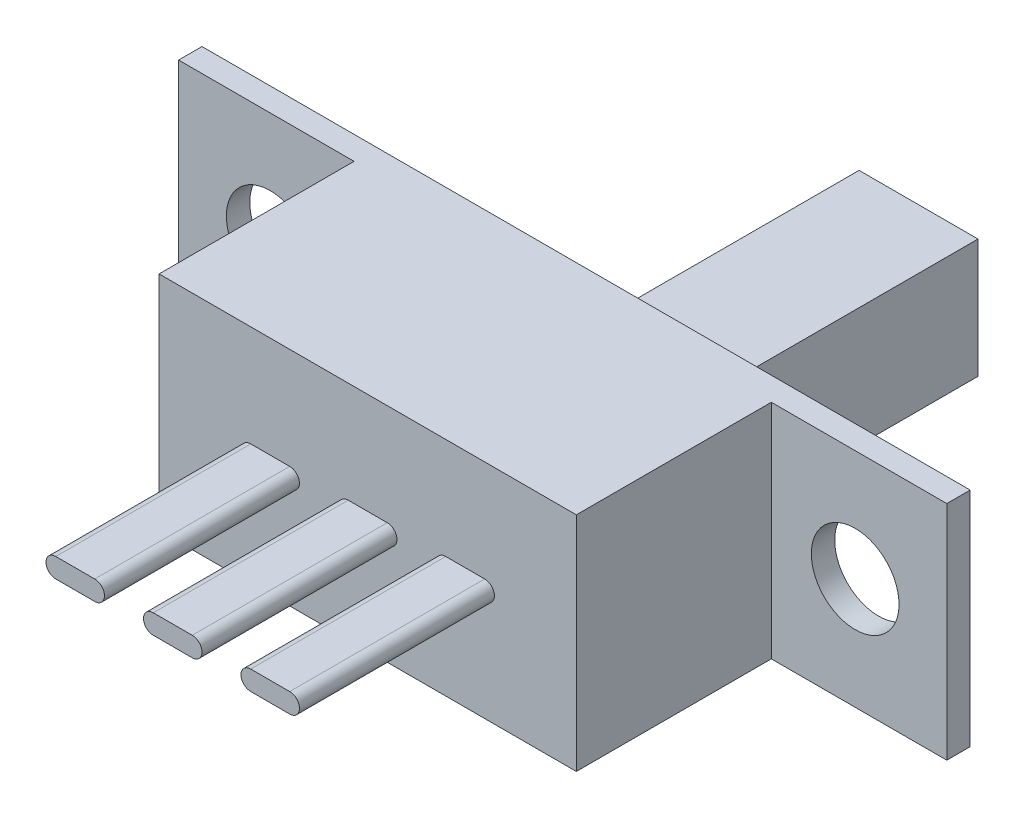
ISO-10303-21;
HEADER;
FILE_DESCRIPTION(('STEP AP214'),'2;1');
FILE_NAME('part.step','',(''),(''),'','','');
FILE_SCHEMA(('AUTOMOTIVE_DESIGN { 1 0 10303 214 1 1 1 1 }'));
ENDSEC;
DATA;
#1=APPLICATION_CONTEXT('core data for automotive mechanical design processes');
#2=APPLICATION_PROTOCOL_DEFINITION('international standard','automotive_design',2000,#1);
#3=PRODUCT_CONTEXT('',#1,'mechanical');
#4=PRODUCT('Part','Part','',(#3));
#5=PRODUCT_RELATED_PRODUCT_CATEGORY('part','',(#4));
#6=PRODUCT_DEFINITION_FORMATION('','',#4);
#7=PRODUCT_DEFINITION_CONTEXT('part definition',#1,'design');
#8=PRODUCT_DEFINITION('design','',#6,#7);
#9=PRODUCT_DEFINITION_SHAPE('','',#8);
#10=(LENGTH_UNIT() NAMED_UNIT(*) SI_UNIT(.MILLI.,.METRE.));
#11=(NAMED_UNIT(*) PLANE_ANGLE_UNIT() SI_UNIT($,.RADIAN.));
#12=(NAMED_UNIT(*) SI_UNIT($,.STERADIAN.) SOLID_ANGLE_UNIT());
#13=UNCERTAINTY_MEASURE_WITH_UNIT(LENGTH_MEASURE(1.E-05),#10,'distance_accuracy_value','');
#14=(GEOMETRIC_REPRESENTATION_CONTEXT(3) GLOBAL_UNCERTAINTY_ASSIGNED_CONTEXT((#13)) GLOBAL_UNIT_ASSIGNED_CONTEXT((#10,
#11,#12)) REPRESENTATION_CONTEXT('',''));
#15=CARTESIAN_POINT('',(0.,0.,0.));
#16=DIRECTION('',(0.,0.,1.));
#17=DIRECTION('',(1.,0.,0.));
#18=AXIS2_PLACEMENT_3D('',#15,#16,#17);
#19=CARTESIAN_POINT('',(0.,0.,5.6));
#20=DIRECTION('',(0.,0.,1.));
#21=DIRECTION('',(1.,0.,0.));
#22=AXIS2_PLACEMENT_3D('',#19,#20,#21);
#23=PLANE('',#22);
#24=DIRECTION('',(0.,-1.,0.));
#25=VECTOR('',#24,1.);
#26=CARTESIAN_POINT('',(-5.34999999999998,-86.65,5.6));
#27=LINE('',#26,#25);
#28=CARTESIAN_POINT('',(-5.34999999999998,-86.65,5.6));
#29=VERTEX_POINT('',#28);
#30=CARTESIAN_POINT('',(-5.34999999999998,-92.35,5.6));
#31=VERTEX_POINT('',#30);
#32=EDGE_CURVE('E320',#29,#31,#27,.T.);
#33=ORIENTED_EDGE('',*,*,#32,.T.);
#34=DIRECTION('',(1.,0.,0.));
#35=VECTOR('',#34,1.);
#36=CARTESIAN_POINT('',(-5.34999999999998,-92.35,5.6));
#37=LINE('',#36,#35);
#38=CARTESIAN_POINT('',(5.35000000000001,-92.35,5.6));
#39=VERTEX_POINT('',#38);
#40=EDGE_CURVE('E323',#31,#39,#37,.T.);
#41=ORIENTED_EDGE('',*,*,#40,.T.);
#42=DIRECTION('',(0.,1.,0.));
#43=VECTOR('',#42,1.);
#44=CARTESIAN_POINT('',(5.35000000000001,-86.65,5.6));
#45=LINE('',#44,#43);
#46=CARTESIAN_POINT('',(5.35000000000001,-86.65,5.6));
#47=VERTEX_POINT('',#46);
#48=EDGE_CURVE('E326',#39,#47,#45,.T.);
#49=ORIENTED_EDGE('',*,*,#48,.T.);
#50=DIRECTION('',(-1.,0.,0.));
#51=VECTOR('',#50,1.);
#52=CARTESIAN_POINT('',(-5.34999999999998,-86.65,5.6));
#53=LINE('',#52,#51);
#54=EDGE_CURVE('E328',#47,#29,#53,.T.);
#55=ORIENTED_EDGE('',*,*,#54,.T.);
#56=EDGE_LOOP('',(#33,#41,#49,#55));
#57=FACE_BOUND('',#56,.T.);
#58=DIRECTION('',(1.,0.,0.));
#59=VECTOR('',#58,1.);
#60=CARTESIAN_POINT('',(-0.499999999999985,-89.75,5.6));
#61=LINE('',#60,#59);
#62=CARTESIAN_POINT('',(-0.499999999999985,-89.75,5.6));
#63=VERTEX_POINT('',#62);
#64=CARTESIAN_POINT('',(0.500000000000015,-89.75,5.6));
#65=VERTEX_POINT('',#64);
#66=EDGE_CURVE('E271',#63,#65,#61,.T.);
#67=ORIENTED_EDGE('',*,*,#66,.F.);
#68=CARTESIAN_POINT('',(-0.499999999999985,-89.5,5.6));
#69=DIRECTION('',(0.,0.,1.));
#70=DIRECTION('',(1.,0.,0.));
#71=AXIS2_PLACEMENT_3D('',#68,#69,#70);
#72=CIRCLE('',#71,0.249999999999986);
#73=CARTESIAN_POINT('',(-0.499999999999985,-89.25,5.6));
#74=VERTEX_POINT('',#73);
#75=EDGE_CURVE('E250',#74,#63,#72,.T.);
#76=ORIENTED_EDGE('',*,*,#75,.F.);
#77=DIRECTION('',(-1.,0.,0.));
#78=VECTOR('',#77,1.);
#79=CARTESIAN_POINT('',(-0.499999999999985,-89.25,5.6));
#80=LINE('',#79,#78);
#81=CARTESIAN_POINT('',(0.500000000000015,-89.25,5.6));
#82=VERTEX_POINT('',#81);
#83=EDGE_CURVE('E262',#82,#74,#80,.T.);
#84=ORIENTED_EDGE('',*,*,#83,.F.);
#85=CARTESIAN_POINT('',(0.500000000000015,-89.5,5.6));
#86=DIRECTION('',(0.,0.,1.));
#87=DIRECTION('',(1.,0.,0.));
#88=AXIS2_PLACEMENT_3D('',#85,#86,#87);
#89=CIRCLE('',#88,0.249999999999986);
#90=EDGE_CURVE('E273',#65,#82,#89,.T.);
#91=ORIENTED_EDGE('',*,*,#90,.F.);
#92=EDGE_LOOP('',(#67,#76,#84,#91));
#93=FACE_BOUND('',#92,.T.);
#94=DIRECTION('',(1.,0.,0.));
#95=VECTOR('',#94,1.);
#96=CARTESIAN_POINT('',(2.00000000000001,-89.75,5.6));
#97=LINE('',#96,#95);
#98=CARTESIAN_POINT('',(2.00000000000001,-89.75,5.6));
#99=VERTEX_POINT('',#98);
#100=CARTESIAN_POINT('',(3.00000000000001,-89.75,5.6));
#101=VERTEX_POINT('',#100);
#102=EDGE_CURVE('E245',#99,#101,#97,.T.);
#103=ORIENTED_EDGE('',*,*,#102,.F.);
#104=CARTESIAN_POINT('',(2.00000000000001,-89.5,5.6));
#105=DIRECTION('',(0.,0.,1.));
#106=DIRECTION('',(1.,0.,0.));
#107=AXIS2_PLACEMENT_3D('',#104,#105,#106);
#108=CIRCLE('',#107,0.25);
#109=CARTESIAN_POINT('',(2.00000000000001,-89.25,5.6));
#110=VERTEX_POINT('',#109);
#111=EDGE_CURVE('E247',#110,#99,#108,.T.);
#112=ORIENTED_EDGE('',*,*,#111,.F.);
#113=DIRECTION('',(-1.,0.,0.));
#114=VECTOR('',#113,1.);
#115=CARTESIAN_POINT('',(2.00000000000001,-89.25,5.6));
#116=LINE('',#115,#114);
#117=CARTESIAN_POINT('',(3.00000000000001,-89.25,5.6));
#118=VERTEX_POINT('',#117);
#119=EDGE_CURVE('E240',#118,#110,#116,.T.);
#120=ORIENTED_EDGE('',*,*,#119,.F.);
#121=CARTESIAN_POINT('',(3.00000000000001,-89.5,5.6));
#122=DIRECTION('',(0.,0.,1.));
#123=DIRECTION('',(1.,0.,0.));
#124=AXIS2_PLACEMENT_3D('',#121,#122,#123);
#125=CIRCLE('',#124,0.25);
#126=EDGE_CURVE('E242',#101,#118,#125,.T.);
#127=ORIENTED_EDGE('',*,*,#126,.F.);
#128=EDGE_LOOP('',(#103,#112,#120,#127));
#129=FACE_BOUND('',#128,.T.);
#130=DIRECTION('',(1.,0.,0.));
#131=VECTOR('',#130,1.);
#132=CARTESIAN_POINT('',(-2.99999999999999,-89.75,5.6));
#133=LINE('',#132,#131);
#134=CARTESIAN_POINT('',(-2.99999999999999,-89.75,5.6));
#135=VERTEX_POINT('',#134);
#136=CARTESIAN_POINT('',(-1.99999999999999,-89.75,5.6));
#137=VERTEX_POINT('',#136);
#138=EDGE_CURVE('E219',#135,#137,#133,.T.);
#139=ORIENTED_EDGE('',*,*,#138,.F.);
#140=CARTESIAN_POINT('',(-2.99999999999999,-89.5,5.6));
#141=DIRECTION('',(0.,0.,1.));
#142=DIRECTION('',(1.,0.,0.));
#143=AXIS2_PLACEMENT_3D('',#140,#141,#142);
#144=CIRCLE('',#143,0.25);
#145=CARTESIAN_POINT('',(-2.99999999999999,-89.25,5.6));
#146=VERTEX_POINT('',#145);
#147=EDGE_CURVE('E214',#146,#135,#144,.T.);
#148=ORIENTED_EDGE('',*,*,#147,.F.);
#149=DIRECTION('',(-1.,0.,0.));
#150=VECTOR('',#149,1.);
#151=CARTESIAN_POINT('',(-2.99999999999999,-89.25,5.6));
#152=LINE('',#151,#150);
#153=CARTESIAN_POINT('',(-1.99999999999999,-89.25,5.6));
#154=VERTEX_POINT('',#153);
#155=EDGE_CURVE('E199',#154,#146,#152,.T.);
#156=ORIENTED_EDGE('',*,*,#155,.F.);
#157=CARTESIAN_POINT('',(-1.99999999999999,-89.5,5.6));
#158=DIRECTION('',(0.,0.,1.));
#159=DIRECTION('',(1.,0.,0.));
#160=AXIS2_PLACEMENT_3D('',#157,#158,#159);
#161=CIRCLE('',#160,0.25);
#162=EDGE_CURVE('E207',#137,#154,#161,.T.);
#163=ORIENTED_EDGE('',*,*,#162,.F.);
#164=EDGE_LOOP('',(#139,#148,#156,#163));
#165=FACE_BOUND('',#164,.T.);
#166=ADVANCED_FACE('F37',(#57,#93,#129,#165),#23,.T.);
#167=CARTESIAN_POINT('',(0.,0.,0.));
#168=DIRECTION('',(0.,0.,1.));
#169=DIRECTION('',(1.,0.,0.));
#170=AXIS2_PLACEMENT_3D('',#167,#168,#169);
#171=PLANE('',#170);
#172=CARTESIAN_POINT('',(7.50000000000001,-89.5,0.));
#173=DIRECTION('',(0.,0.,1.));
#174=DIRECTION('',(1.,0.,0.));
#175=AXIS2_PLACEMENT_3D('',#172,#173,#174);
#176=CIRCLE('',#175,1.125);
#177=CARTESIAN_POINT('',(8.62500000000001,-89.5,0.));
#178=VERTEX_POINT('',#177);
#179=EDGE_CURVE('E346',#178,#178,#176,.T.);
#180=ORIENTED_EDGE('',*,*,#179,.T.);
#181=EDGE_LOOP('',(#180));
#182=FACE_BOUND('',#181,.T.);
#183=CARTESIAN_POINT('',(-7.49999999999998,-89.5,0.));
#184=DIRECTION('',(0.,0.,1.));
#185=DIRECTION('',(1.,0.,0.));
#186=AXIS2_PLACEMENT_3D('',#183,#184,#185);
#187=CIRCLE('',#186,1.125);
#188=CARTESIAN_POINT('',(-6.37499999999998,-89.5,0.));
#189=VERTEX_POINT('',#188);
#190=EDGE_CURVE('E350',#189,#189,#187,.T.);
#191=ORIENTED_EDGE('',*,*,#190,.T.);
#192=EDGE_LOOP('',(#191));
#193=FACE_BOUND('',#192,.T.);
#194=DIRECTION('',(0.,1.,0.));
#195=VECTOR('',#194,1.);
#196=CARTESIAN_POINT('',(9.85000000000001,-92.35,0.));
#197=LINE('',#196,#195);
#198=CARTESIAN_POINT('',(9.85000000000001,-92.35,0.));
#199=VERTEX_POINT('',#198);
#200=CARTESIAN_POINT('',(9.85000000000001,-86.65,0.));
#201=VERTEX_POINT('',#200);
#202=EDGE_CURVE('E356',#199,#201,#197,.T.);
#203=ORIENTED_EDGE('',*,*,#202,.F.);
#204=DIRECTION('',(1.,0.,0.));
#205=VECTOR('',#204,1.);
#206=CARTESIAN_POINT('',(9.85000000000001,-92.35,0.));
#207=LINE('',#206,#205);
#208=CARTESIAN_POINT('',(-9.84999999999999,-92.35,0.));
#209=VERTEX_POINT('',#208);
#210=EDGE_CURVE('E363',#209,#199,#207,.T.);
#211=ORIENTED_EDGE('',*,*,#210,.F.);
#212=DIRECTION('',(0.,-1.,0.));
#213=VECTOR('',#212,1.);
#214=CARTESIAN_POINT('',(-9.84999999999999,-92.35,0.));
#215=LINE('',#214,#213);
#216=CARTESIAN_POINT('',(-9.84999999999999,-86.65,0.));
#217=VERTEX_POINT('',#216);
#218=EDGE_CURVE('E376',#217,#209,#215,.T.);
#219=ORIENTED_EDGE('',*,*,#218,.F.);
#220=DIRECTION('',(-1.,0.,0.));
#221=VECTOR('',#220,1.);
#222=CARTESIAN_POINT('',(9.85000000000001,-86.65,0.));
#223=LINE('',#222,#221);
#224=EDGE_CURVE('E374',#201,#217,#223,.T.);
#225=ORIENTED_EDGE('',*,*,#224,.F.);
#226=EDGE_LOOP('',(#203,#211,#219,#225));
#227=FACE_BOUND('',#226,.T.);
#228=DIRECTION('',(0.,-1.,0.));
#229=VECTOR('',#228,1.);
#230=CARTESIAN_POINT('',(3.05000000000001,-87.975,0.));
#231=LINE('',#230,#229);
#232=CARTESIAN_POINT('',(3.05000000000001,-87.975,0.));
#233=VERTEX_POINT('',#232);
#234=CARTESIAN_POINT('',(3.05000000000001,-91.025,0.));
#235=VERTEX_POINT('',#234);
#236=EDGE_CURVE('E286',#233,#235,#231,.T.);
#237=ORIENTED_EDGE('',*,*,#236,.F.);
#238=DIRECTION('',(1.,0.,0.));
#239=VECTOR('',#238,1.);
#240=CARTESIAN_POINT('',(3.05000000000001,-87.975,0.));
#241=LINE('',#240,#239);
#242=CARTESIAN_POINT('',(0.,-87.975,0.));
#243=VERTEX_POINT('',#242);
#244=EDGE_CURVE('E291',#243,#233,#241,.T.);
#245=ORIENTED_EDGE('',*,*,#244,.F.);
#246=DIRECTION('',(0.,1.,0.));
#247=VECTOR('',#246,1.);
#248=CARTESIAN_POINT('',(0.,-87.975,0.));
#249=LINE('',#248,#247);
#250=CARTESIAN_POINT('',(0.,-91.025,0.));
#251=VERTEX_POINT('',#250);
#252=EDGE_CURVE('E303',#251,#243,#249,.T.);
#253=ORIENTED_EDGE('',*,*,#252,.F.);
#254=DIRECTION('',(-1.,0.,0.));
#255=VECTOR('',#254,1.);
#256=CARTESIAN_POINT('',(3.05000000000001,-91.025,0.));
#257=LINE('',#256,#255);
#258=EDGE_CURVE('E300',#235,#251,#257,.T.);
#259=ORIENTED_EDGE('',*,*,#258,.F.);
#260=EDGE_LOOP('',(#237,#245,#253,#259));
#261=FACE_BOUND('',#260,.T.);
#262=ADVANCED_FACE('F395',(#182,#193,#227,#261),#171,.F.);
#263=CARTESIAN_POINT('',(0.,0.,0.6));
#264=DIRECTION('',(0.,0.,1.));
#265=DIRECTION('',(1.,0.,0.));
#266=AXIS2_PLACEMENT_3D('',#263,#264,#265);
#267=PLANE('',#266);
#268=DIRECTION('',(0.,-1.,0.));
#269=VECTOR('',#268,1.);
#270=CARTESIAN_POINT('',(-5.34999999999998,-86.65,0.6));
#271=LINE('',#270,#269);
#272=CARTESIAN_POINT('',(-5.34999999999998,-86.65,0.6));
#273=VERTEX_POINT('',#272);
#274=CARTESIAN_POINT('',(-5.34999999999998,-92.35,0.6));
#275=VERTEX_POINT('',#274);
#276=EDGE_CURVE('E319',#273,#275,#271,.T.);
#277=ORIENTED_EDGE('',*,*,#276,.F.);
#278=DIRECTION('',(-1.,0.,0.));
#279=VECTOR('',#278,1.);
#280=CARTESIAN_POINT('',(9.85000000000001,-86.65,0.6));
#281=LINE('',#280,#279);
#282=CARTESIAN_POINT('',(-9.84999999999999,-86.65,0.6));
#283=VERTEX_POINT('',#282);
#284=EDGE_CURVE('E362',#273,#283,#281,.T.);
#285=ORIENTED_EDGE('',*,*,#284,.T.);
#286=DIRECTION('',(0.,-1.,0.));
#287=VECTOR('',#286,1.);
#288=CARTESIAN_POINT('',(-9.84999999999999,-92.35,0.6));
#289=LINE('',#288,#287);
#290=CARTESIAN_POINT('',(-9.84999999999999,-92.35,0.6));
#291=VERTEX_POINT('',#290);
#292=EDGE_CURVE('E366',#283,#291,#289,.T.);
#293=ORIENTED_EDGE('',*,*,#292,.T.);
#294=DIRECTION('',(1.,0.,0.));
#295=VECTOR('',#294,1.);
#296=CARTESIAN_POINT('',(9.85000000000001,-92.35,0.6));
#297=LINE('',#296,#295);
#298=EDGE_CURVE('E369',#291,#275,#297,.T.);
#299=ORIENTED_EDGE('',*,*,#298,.T.);
#300=EDGE_LOOP('',(#277,#285,#293,#299));
#301=FACE_BOUND('',#300,.T.);
#302=CARTESIAN_POINT('',(-7.49999999999998,-89.5,0.6));
#303=DIRECTION('',(0.,0.,1.));
#304=DIRECTION('',(1.,0.,0.));
#305=AXIS2_PLACEMENT_3D('',#302,#303,#304);
#306=CIRCLE('',#305,1.125);
#307=CARTESIAN_POINT('',(-6.37499999999998,-89.5,0.6));
#308=VERTEX_POINT('',#307);
#309=EDGE_CURVE('E353',#308,#308,#306,.T.);
#310=ORIENTED_EDGE('',*,*,#309,.F.);
#311=EDGE_LOOP('',(#310));
#312=FACE_BOUND('',#311,.T.);
#313=ADVANCED_FACE('F422',(#301,#312),#267,.T.);
#314=DIRECTION('',(0.,1.,0.));
#315=VECTOR('',#314,1.);
#316=CARTESIAN_POINT('',(5.35000000000001,-86.65,0.6));
#317=LINE('',#316,#315);
#318=CARTESIAN_POINT('',(5.35000000000001,-92.35,0.6));
#319=VERTEX_POINT('',#318);
#320=CARTESIAN_POINT('',(5.35000000000001,-86.65,0.6));
#321=VERTEX_POINT('',#320);
#322=EDGE_CURVE('E324',#319,#321,#317,.T.);
#323=ORIENTED_EDGE('',*,*,#322,.F.);
#324=CARTESIAN_POINT('',(9.85000000000001,-92.35,0.6));
#325=VERTEX_POINT('',#324);
#326=EDGE_CURVE('E368',#319,#325,#297,.T.);
#327=ORIENTED_EDGE('',*,*,#326,.T.);
#328=DIRECTION('',(0.,1.,0.));
#329=VECTOR('',#328,1.);
#330=CARTESIAN_POINT('',(9.85000000000001,-92.35,0.6));
#331=LINE('',#330,#329);
#332=CARTESIAN_POINT('',(9.85000000000001,-86.65,0.6));
#333=VERTEX_POINT('',#332);
#334=EDGE_CURVE('E359',#325,#333,#331,.T.);
#335=ORIENTED_EDGE('',*,*,#334,.T.);
#336=EDGE_CURVE('E364',#333,#321,#281,.T.);
#337=ORIENTED_EDGE('',*,*,#336,.T.);
#338=EDGE_LOOP('',(#323,#327,#335,#337));
#339=FACE_BOUND('',#338,.T.);
#340=CARTESIAN_POINT('',(7.50000000000001,-89.5,0.6));
#341=DIRECTION('',(0.,0.,1.));
#342=DIRECTION('',(1.,0.,0.));
#343=AXIS2_PLACEMENT_3D('',#340,#341,#342);
#344=CIRCLE('',#343,1.125);
#345=CARTESIAN_POINT('',(8.62500000000001,-89.5,0.6));
#346=VERTEX_POINT('',#345);
#347=EDGE_CURVE('E347',#346,#346,#344,.T.);
#348=ORIENTED_EDGE('',*,*,#347,.F.);
#349=EDGE_LOOP('',(#348));
#350=FACE_BOUND('',#349,.T.);
#351=ADVANCED_FACE('F406',(#339,#350),#267,.T.);
#352=CARTESIAN_POINT('',(9.85000000000001,-92.35,0.6));
#353=DIRECTION('',(-1.,0.,0.));
#354=DIRECTION('',(0.,0.,1.));
#355=AXIS2_PLACEMENT_3D('',#352,#353,#354);
#356=PLANE('',#355);
#357=ORIENTED_EDGE('',*,*,#202,.T.);
#358=DIRECTION('',(0.,0.,-1.));
#359=VECTOR('',#358,1.);
#360=CARTESIAN_POINT('',(9.85000000000001,-86.65,0.6));
#361=LINE('',#360,#359);
#362=EDGE_CURVE('E11',#333,#201,#361,.T.);
#363=ORIENTED_EDGE('',*,*,#362,.F.);
#364=ORIENTED_EDGE('',*,*,#334,.F.);
#365=DIRECTION('',(0.,0.,-1.));
#366=VECTOR('',#365,1.);
#367=CARTESIAN_POINT('',(9.85000000000001,-92.35,0.6));
#368=LINE('',#367,#366);
#369=EDGE_CURVE('E371',#325,#199,#368,.T.);
#370=ORIENTED_EDGE('',*,*,#369,.T.);
#371=EDGE_LOOP('',(#357,#363,#364,#370));
#372=FACE_BOUND('',#371,.T.);
#373=ADVANCED_FACE('F39',(#372),#356,.F.);
#374=CARTESIAN_POINT('',(9.85000000000001,-86.65,0.6));
#375=DIRECTION('',(0.,-1.,0.));
#376=DIRECTION('',(0.,0.,-1.));
#377=AXIS2_PLACEMENT_3D('',#374,#375,#376);
#378=PLANE('',#377);
#379=ORIENTED_EDGE('',*,*,#224,.T.);
#380=DIRECTION('',(0.,0.,-1.));
#381=VECTOR('',#380,1.);
#382=CARTESIAN_POINT('',(-9.84999999999999,-86.65,0.6));
#383=LINE('',#382,#381);
#384=EDGE_CURVE('E45',#283,#217,#383,.T.);
#385=ORIENTED_EDGE('',*,*,#384,.F.);
#386=ORIENTED_EDGE('',*,*,#284,.F.);
#387=DIRECTION('',(0.,0.,-1.));
#388=VECTOR('',#387,1.);
#389=CARTESIAN_POINT('',(-5.34999999999998,-86.65,5.6));
#390=LINE('',#389,#388);
#391=EDGE_CURVE('E330',#29,#273,#390,.T.);
#392=ORIENTED_EDGE('',*,*,#391,.F.);
#393=ORIENTED_EDGE('',*,*,#54,.F.);
#394=DIRECTION('',(0.,0.,-1.));
#395=VECTOR('',#394,1.);
#396=CARTESIAN_POINT('',(5.35000000000001,-86.65,5.6));
#397=LINE('',#396,#395);
#398=EDGE_CURVE('E337',#47,#321,#397,.T.);
#399=ORIENTED_EDGE('',*,*,#398,.T.);
#400=ORIENTED_EDGE('',*,*,#336,.F.);
#401=ORIENTED_EDGE('',*,*,#362,.T.);
#402=EDGE_LOOP('',(#379,#385,#386,#392,#393,#399,#400,#401));
#403=FACE_BOUND('',#402,.T.);
#404=ADVANCED_FACE('F424',(#403),#378,.F.);
#405=CARTESIAN_POINT('',(-9.84999999999999,-92.35,0.6));
#406=DIRECTION('',(1.,0.,0.));
#407=DIRECTION('',(0.,0.,-1.));
#408=AXIS2_PLACEMENT_3D('',#405,#406,#407);
#409=PLANE('',#408);
#410=ORIENTED_EDGE('',*,*,#218,.T.);
#411=DIRECTION('',(0.,0.,-1.));
#412=VECTOR('',#411,1.);
#413=CARTESIAN_POINT('',(-9.84999999999999,-92.35,0.6));
#414=LINE('',#413,#412);
#415=EDGE_CURVE('E381',#291,#209,#414,.T.);
#416=ORIENTED_EDGE('',*,*,#415,.F.);
#417=ORIENTED_EDGE('',*,*,#292,.F.);
#418=ORIENTED_EDGE('',*,*,#384,.T.);
#419=EDGE_LOOP('',(#410,#416,#417,#418));
#420=FACE_BOUND('',#419,.T.);
#421=ADVANCED_FACE('F388',(#420),#409,.F.);
#422=CARTESIAN_POINT('',(9.85000000000001,-92.35,0.6));
#423=DIRECTION('',(0.,1.,0.));
#424=DIRECTION('',(0.,0.,1.));
#425=AXIS2_PLACEMENT_3D('',#422,#423,#424);
#426=PLANE('',#425);
#427=ORIENTED_EDGE('',*,*,#210,.T.);
#428=ORIENTED_EDGE('',*,*,#369,.F.);
#429=ORIENTED_EDGE('',*,*,#326,.F.);
#430=DIRECTION('',(0.,0.,-1.));
#431=VECTOR('',#430,1.);
#432=CARTESIAN_POINT('',(5.35000000000001,-92.35,5.6));
#433=LINE('',#432,#431);
#434=EDGE_CURVE('E340',#39,#319,#433,.T.);
#435=ORIENTED_EDGE('',*,*,#434,.F.);
#436=ORIENTED_EDGE('',*,*,#40,.F.);
#437=DIRECTION('',(0.,0.,-1.));
#438=VECTOR('',#437,1.);
#439=CARTESIAN_POINT('',(-5.34999999999998,-92.35,5.6));
#440=LINE('',#439,#438);
#441=EDGE_CURVE('E343',#31,#275,#440,.T.);
#442=ORIENTED_EDGE('',*,*,#441,.T.);
#443=ORIENTED_EDGE('',*,*,#298,.F.);
#444=ORIENTED_EDGE('',*,*,#415,.T.);
#445=EDGE_LOOP('',(#427,#428,#429,#435,#436,#442,#443,#444));
#446=FACE_BOUND('',#445,.T.);
#447=ADVANCED_FACE('F399',(#446),#426,.F.);
#448=CARTESIAN_POINT('',(-7.49999999999998,-89.5,0.6));
#449=DIRECTION('',(0.,0.,-1.));
#450=DIRECTION('',(-1.,0.,0.));
#451=AXIS2_PLACEMENT_3D('',#448,#449,#450);
#452=CYLINDRICAL_SURFACE('',#451,1.125);
#453=ORIENTED_EDGE('',*,*,#309,.T.);
#454=EDGE_LOOP('',(#453));
#455=FACE_BOUND('',#454,.T.);
#456=ORIENTED_EDGE('',*,*,#190,.F.);
#457=EDGE_LOOP('',(#456));
#458=FACE_BOUND('',#457,.T.);
#459=ADVANCED_FACE('F449',(#455,#458),#452,.F.);
#460=CARTESIAN_POINT('',(7.50000000000001,-89.5,0.6));
#461=DIRECTION('',(0.,0.,-1.));
#462=DIRECTION('',(-1.,0.,0.));
#463=AXIS2_PLACEMENT_3D('',#460,#461,#462);
#464=CYLINDRICAL_SURFACE('',#463,1.125);
#465=ORIENTED_EDGE('',*,*,#347,.T.);
#466=EDGE_LOOP('',(#465));
#467=FACE_BOUND('',#466,.T.);
#468=ORIENTED_EDGE('',*,*,#179,.F.);
#469=EDGE_LOOP('',(#468));
#470=FACE_BOUND('',#469,.T.);
#471=ADVANCED_FACE('F446',(#467,#470),#464,.F.);
#472=CARTESIAN_POINT('',(-5.34999999999998,-86.65,5.6));
#473=DIRECTION('',(1.,0.,0.));
#474=DIRECTION('',(0.,0.,-1.));
#475=AXIS2_PLACEMENT_3D('',#472,#473,#474);
#476=PLANE('',#475);
#477=ORIENTED_EDGE('',*,*,#276,.T.);
#478=ORIENTED_EDGE('',*,*,#441,.F.);
#479=ORIENTED_EDGE('',*,*,#32,.F.);
#480=ORIENTED_EDGE('',*,*,#391,.T.);
#481=EDGE_LOOP('',(#477,#478,#479,#480));
#482=FACE_BOUND('',#481,.T.);
#483=ADVANCED_FACE('F420',(#482),#476,.F.);
#484=CARTESIAN_POINT('',(5.35000000000001,-86.65,5.6));
#485=DIRECTION('',(-1.,0.,0.));
#486=DIRECTION('',(0.,0.,1.));
#487=AXIS2_PLACEMENT_3D('',#484,#485,#486);
#488=PLANE('',#487);
#489=ORIENTED_EDGE('',*,*,#322,.T.);
#490=ORIENTED_EDGE('',*,*,#398,.F.);
#491=ORIENTED_EDGE('',*,*,#48,.F.);
#492=ORIENTED_EDGE('',*,*,#434,.T.);
#493=EDGE_LOOP('',(#489,#490,#491,#492));
#494=FACE_BOUND('',#493,.T.);
#495=ADVANCED_FACE('F411',(#494),#488,.F.);
#496=CARTESIAN_POINT('',(3.05000000000001,-87.975,-7.));
#497=DIRECTION('',(-1.,0.,0.));
#498=DIRECTION('',(0.,0.,1.));
#499=AXIS2_PLACEMENT_3D('',#496,#497,#498);
#500=PLANE('',#499);
#501=ORIENTED_EDGE('',*,*,#236,.T.);
#502=DIRECTION('',(0.,0.,1.));
#503=VECTOR('',#502,1.);
#504=CARTESIAN_POINT('',(3.05000000000001,-91.025,-7.));
#505=LINE('',#504,#503);
#506=CARTESIAN_POINT('',(3.05000000000001,-91.025,-7.));
#507=VERTEX_POINT('',#506);
#508=EDGE_CURVE('E316',#507,#235,#505,.T.);
#509=ORIENTED_EDGE('',*,*,#508,.F.);
#510=DIRECTION('',(0.,-1.,0.));
#511=VECTOR('',#510,1.);
#512=CARTESIAN_POINT('',(3.05000000000001,-87.975,-7.));
#513=LINE('',#512,#511);
#514=CARTESIAN_POINT('',(3.05000000000001,-87.975,-7.));
#515=VERTEX_POINT('',#514);
#516=EDGE_CURVE('E287',#515,#507,#513,.T.);
#517=ORIENTED_EDGE('',*,*,#516,.F.);
#518=DIRECTION('',(0.,0.,1.));
#519=VECTOR('',#518,1.);
#520=CARTESIAN_POINT('',(3.05000000000001,-87.975,-7.));
#521=LINE('',#520,#519);
#522=EDGE_CURVE('E297',#515,#233,#521,.T.);
#523=ORIENTED_EDGE('',*,*,#522,.T.);
#524=EDGE_LOOP('',(#501,#509,#517,#523));
#525=FACE_BOUND('',#524,.T.);
#526=ADVANCED_FACE('F440',(#525),#500,.F.);
#527=CARTESIAN_POINT('',(3.05000000000001,-91.025,-7.));
#528=DIRECTION('',(0.,1.,0.));
#529=DIRECTION('',(0.,0.,1.));
#530=AXIS2_PLACEMENT_3D('',#527,#528,#529);
#531=PLANE('',#530);
#532=ORIENTED_EDGE('',*,*,#258,.T.);
#533=DIRECTION('',(0.,0.,1.));
#534=VECTOR('',#533,1.);
#535=CARTESIAN_POINT('',(0.,-91.025,-7.));
#536=LINE('',#535,#534);
#537=CARTESIAN_POINT('',(0.,-91.025,-7.));
#538=VERTEX_POINT('',#537);
#539=EDGE_CURVE('E313',#538,#251,#536,.T.);
#540=ORIENTED_EDGE('',*,*,#539,.F.);
#541=DIRECTION('',(-1.,0.,0.));
#542=VECTOR('',#541,1.);
#543=CARTESIAN_POINT('',(3.05000000000001,-91.025,-7.));
#544=LINE('',#543,#542);
#545=EDGE_CURVE('E290',#507,#538,#544,.T.);
#546=ORIENTED_EDGE('',*,*,#545,.F.);
#547=ORIENTED_EDGE('',*,*,#508,.T.);
#548=EDGE_LOOP('',(#532,#540,#546,#547));
#549=FACE_BOUND('',#548,.T.);
#550=ADVANCED_FACE('F485',(#549),#531,.F.);
#551=CARTESIAN_POINT('',(0.,-87.975,-7.));
#552=DIRECTION('',(1.,0.,0.));
#553=DIRECTION('',(0.,0.,-1.));
#554=AXIS2_PLACEMENT_3D('',#551,#552,#553);
#555=PLANE('',#554);
#556=ORIENTED_EDGE('',*,*,#252,.T.);
#557=DIRECTION('',(0.,0.,1.));
#558=VECTOR('',#557,1.);
#559=CARTESIAN_POINT('',(0.,-87.975,-7.));
#560=LINE('',#559,#558);
#561=CARTESIAN_POINT('',(0.,-87.975,-7.));
#562=VERTEX_POINT('',#561);
#563=EDGE_CURVE('E310',#562,#243,#560,.T.);
#564=ORIENTED_EDGE('',*,*,#563,.F.);
#565=DIRECTION('',(0.,1.,0.));
#566=VECTOR('',#565,1.);
#567=CARTESIAN_POINT('',(0.,-87.975,-7.));
#568=LINE('',#567,#566);
#569=EDGE_CURVE('E293',#538,#562,#568,.T.);
#570=ORIENTED_EDGE('',*,*,#569,.F.);
#571=ORIENTED_EDGE('',*,*,#539,.T.);
#572=EDGE_LOOP('',(#556,#564,#570,#571));
#573=FACE_BOUND('',#572,.T.);
#574=ADVANCED_FACE('F492',(#573),#555,.F.);
#575=CARTESIAN_POINT('',(3.05000000000001,-87.975,-7.));
#576=DIRECTION('',(0.,-1.,0.));
#577=DIRECTION('',(0.,0.,-1.));
#578=AXIS2_PLACEMENT_3D('',#575,#576,#577);
#579=PLANE('',#578);
#580=ORIENTED_EDGE('',*,*,#244,.T.);
#581=ORIENTED_EDGE('',*,*,#522,.F.);
#582=DIRECTION('',(1.,0.,0.));
#583=VECTOR('',#582,1.);
#584=CARTESIAN_POINT('',(3.05000000000001,-87.975,-7.));
#585=LINE('',#584,#583);
#586=EDGE_CURVE('E295',#562,#515,#585,.T.);
#587=ORIENTED_EDGE('',*,*,#586,.F.);
#588=ORIENTED_EDGE('',*,*,#563,.T.);
#589=EDGE_LOOP('',(#580,#581,#587,#588));
#590=FACE_BOUND('',#589,.T.);
#591=ADVANCED_FACE('F499',(#590),#579,.F.);
#592=CARTESIAN_POINT('',(0.,0.,-7.));
#593=DIRECTION('',(0.,0.,-1.));
#594=DIRECTION('',(-1.,0.,0.));
#595=AXIS2_PLACEMENT_3D('',#592,#593,#594);
#596=PLANE('',#595);
#597=ORIENTED_EDGE('',*,*,#516,.T.);
#598=ORIENTED_EDGE('',*,*,#545,.T.);
#599=ORIENTED_EDGE('',*,*,#569,.T.);
#600=ORIENTED_EDGE('',*,*,#586,.T.);
#601=EDGE_LOOP('',(#597,#598,#599,#600));
#602=FACE_BOUND('',#601,.T.);
#603=ADVANCED_FACE('F507',(#602),#596,.T.);
#604=CARTESIAN_POINT('',(-0.499999999999985,-89.5,10.6));
#605=DIRECTION('',(0.,0.,-1.));
#606=DIRECTION('',(-1.,0.,0.));
#607=AXIS2_PLACEMENT_3D('',#604,#605,#606);
#608=CYLINDRICAL_SURFACE('',#607,0.249999999999986);
#609=ORIENTED_EDGE('',*,*,#75,.T.);
#610=DIRECTION('',(0.,0.,-1.));
#611=VECTOR('',#610,1.);
#612=CARTESIAN_POINT('',(-0.499999999999985,-89.75,10.6));
#613=LINE('',#612,#611);
#614=CARTESIAN_POINT('',(-0.499999999999985,-89.75,10.6));
#615=VERTEX_POINT('',#614);
#616=EDGE_CURVE('E284',#615,#63,#613,.T.);
#617=ORIENTED_EDGE('',*,*,#616,.F.);
#618=CARTESIAN_POINT('',(-0.499999999999985,-89.5,10.6));
#619=DIRECTION('',(0.,0.,1.));
#620=DIRECTION('',(1.,0.,0.));
#621=AXIS2_PLACEMENT_3D('',#618,#619,#620);
#622=CIRCLE('',#621,0.249999999999986);
#623=CARTESIAN_POINT('',(-0.499999999999985,-89.25,10.6));
#624=VERTEX_POINT('',#623);
#625=EDGE_CURVE('E258',#624,#615,#622,.T.);
#626=ORIENTED_EDGE('',*,*,#625,.F.);
#627=DIRECTION('',(0.,0.,-1.));
#628=VECTOR('',#627,1.);
#629=CARTESIAN_POINT('',(-0.499999999999985,-89.25,10.6));
#630=LINE('',#629,#628);
#631=EDGE_CURVE('E268',#624,#74,#630,.T.);
#632=ORIENTED_EDGE('',*,*,#631,.T.);
#633=EDGE_LOOP('',(#609,#617,#626,#632));
#634=FACE_BOUND('',#633,.T.);
#635=ADVANCED_FACE('F515',(#634),#608,.T.);
#636=CARTESIAN_POINT('',(-0.499999999999985,-89.75,10.6));
#637=DIRECTION('',(0.,1.,0.));
#638=DIRECTION('',(0.,0.,1.));
#639=AXIS2_PLACEMENT_3D('',#636,#637,#638);
#640=PLANE('',#639);
#641=ORIENTED_EDGE('',*,*,#66,.T.);
#642=DIRECTION('',(0.,0.,-1.));
#643=VECTOR('',#642,1.);
#644=CARTESIAN_POINT('',(0.500000000000015,-89.75,10.6));
#645=LINE('',#644,#643);
#646=CARTESIAN_POINT('',(0.500000000000015,-89.75,10.6));
#647=VERTEX_POINT('',#646);
#648=EDGE_CURVE('E281',#647,#65,#645,.T.);
#649=ORIENTED_EDGE('',*,*,#648,.F.);
#650=DIRECTION('',(1.,0.,0.));
#651=VECTOR('',#650,1.);
#652=CARTESIAN_POINT('',(-0.499999999999985,-89.75,10.6));
#653=LINE('',#652,#651);
#654=EDGE_CURVE('E261',#615,#647,#653,.T.);
#655=ORIENTED_EDGE('',*,*,#654,.F.);
#656=ORIENTED_EDGE('',*,*,#616,.T.);
#657=EDGE_LOOP('',(#641,#649,#655,#656));
#658=FACE_BOUND('',#657,.T.);
#659=ADVANCED_FACE('F523',(#658),#640,.F.);
#660=CARTESIAN_POINT('',(0.500000000000015,-89.5,10.6));
#661=DIRECTION('',(0.,0.,-1.));
#662=DIRECTION('',(-1.,0.,0.));
#663=AXIS2_PLACEMENT_3D('',#660,#661,#662);
#664=CYLINDRICAL_SURFACE('',#663,0.249999999999986);
#665=ORIENTED_EDGE('',*,*,#90,.T.);
#666=DIRECTION('',(0.,0.,-1.));
#667=VECTOR('',#666,1.);
#668=CARTESIAN_POINT('',(0.500000000000015,-89.25,10.6));
#669=LINE('',#668,#667);
#670=CARTESIAN_POINT('',(0.500000000000015,-89.25,10.6));
#671=VERTEX_POINT('',#670);
#672=EDGE_CURVE('E279',#671,#82,#669,.T.);
#673=ORIENTED_EDGE('',*,*,#672,.F.);
#674=CARTESIAN_POINT('',(0.500000000000015,-89.5,10.6));
#675=DIRECTION('',(0.,0.,1.));
#676=DIRECTION('',(1.,0.,0.));
#677=AXIS2_PLACEMENT_3D('',#674,#675,#676);
#678=CIRCLE('',#677,0.249999999999986);
#679=EDGE_CURVE('E264',#647,#671,#678,.T.);
#680=ORIENTED_EDGE('',*,*,#679,.F.);
#681=ORIENTED_EDGE('',*,*,#648,.T.);
#682=EDGE_LOOP('',(#665,#673,#680,#681));
#683=FACE_BOUND('',#682,.T.);
#684=ADVANCED_FACE('F531',(#683),#664,.T.);
#685=CARTESIAN_POINT('',(-0.499999999999985,-89.25,10.6));
#686=DIRECTION('',(0.,-1.,0.));
#687=DIRECTION('',(0.,0.,-1.));
#688=AXIS2_PLACEMENT_3D('',#685,#686,#687);
#689=PLANE('',#688);
#690=ORIENTED_EDGE('',*,*,#83,.T.);
#691=ORIENTED_EDGE('',*,*,#631,.F.);
#692=DIRECTION('',(-1.,0.,0.));
#693=VECTOR('',#692,1.);
#694=CARTESIAN_POINT('',(-0.499999999999985,-89.25,10.6));
#695=LINE('',#694,#693);
#696=EDGE_CURVE('E266',#671,#624,#695,.T.);
#697=ORIENTED_EDGE('',*,*,#696,.F.);
#698=ORIENTED_EDGE('',*,*,#672,.T.);
#699=EDGE_LOOP('',(#690,#691,#697,#698));
#700=FACE_BOUND('',#699,.T.);
#701=ADVANCED_FACE('F539',(#700),#689,.F.);
#702=CARTESIAN_POINT('',(-0.499999999999985,-89.5,10.6));
#703=DIRECTION('',(0.,0.,1.));
#704=DIRECTION('',(1.,0.,0.));
#705=AXIS2_PLACEMENT_3D('',#702,#703,#704);
#706=PLANE('',#705);
#707=ORIENTED_EDGE('',*,*,#625,.T.);
#708=ORIENTED_EDGE('',*,*,#654,.T.);
#709=ORIENTED_EDGE('',*,*,#679,.T.);
#710=ORIENTED_EDGE('',*,*,#696,.T.);
#711=EDGE_LOOP('',(#707,#708,#709,#710));
#712=FACE_BOUND('',#711,.T.);
#713=ADVANCED_FACE('F547',(#712),#706,.T.);
#714=CARTESIAN_POINT('',(2.00000000000001,-89.5,10.6));
#715=DIRECTION('',(0.,0.,-1.));
#716=DIRECTION('',(-1.,0.,0.));
#717=AXIS2_PLACEMENT_3D('',#714,#715,#716);
#718=CYLINDRICAL_SURFACE('',#717,0.25);
#719=ORIENTED_EDGE('',*,*,#111,.T.);
#720=DIRECTION('',(0.,0.,-1.));
#721=VECTOR('',#720,1.);
#722=CARTESIAN_POINT('',(2.00000000000001,-89.75,10.6));
#723=LINE('',#722,#721);
#724=CARTESIAN_POINT('',(2.00000000000001,-89.75,10.6));
#725=VERTEX_POINT('',#724);
#726=EDGE_CURVE('E220',#725,#99,#723,.T.);
#727=ORIENTED_EDGE('',*,*,#726,.F.);
#728=CARTESIAN_POINT('',(2.00000000000001,-89.5,10.6));
#729=DIRECTION('',(0.,0.,1.));
#730=DIRECTION('',(1.,0.,0.));
#731=AXIS2_PLACEMENT_3D('',#728,#729,#730);
#732=CIRCLE('',#731,0.25);
#733=CARTESIAN_POINT('',(2.00000000000001,-89.25,10.6));
#734=VERTEX_POINT('',#733);
#735=EDGE_CURVE('E243',#734,#725,#732,.T.);
#736=ORIENTED_EDGE('',*,*,#735,.F.);
#737=DIRECTION('',(0.,0.,-1.));
#738=VECTOR('',#737,1.);
#739=CARTESIAN_POINT('',(2.00000000000001,-89.25,10.6));
#740=LINE('',#739,#738);
#741=EDGE_CURVE('E236',#734,#110,#740,.T.);
#742=ORIENTED_EDGE('',*,*,#741,.T.);
#743=EDGE_LOOP('',(#719,#727,#736,#742));
#744=FACE_BOUND('',#743,.T.);
#745=ADVANCED_FACE('F555',(#744),#718,.T.);
#746=CARTESIAN_POINT('',(2.00000000000001,-89.75,10.6));
#747=DIRECTION('',(0.,1.,0.));
#748=DIRECTION('',(0.,0.,1.));
#749=AXIS2_PLACEMENT_3D('',#746,#747,#748);
#750=PLANE('',#749);
#751=ORIENTED_EDGE('',*,*,#102,.T.);
#752=DIRECTION('',(0.,0.,-1.));
#753=VECTOR('',#752,1.);
#754=CARTESIAN_POINT('',(3.00000000000001,-89.75,10.6));
#755=LINE('',#754,#753);
#756=CARTESIAN_POINT('',(3.00000000000001,-89.75,10.6));
#757=VERTEX_POINT('',#756);
#758=EDGE_CURVE('E222',#757,#101,#755,.T.);
#759=ORIENTED_EDGE('',*,*,#758,.F.);
#760=DIRECTION('',(1.,0.,0.));
#761=VECTOR('',#760,1.);
#762=CARTESIAN_POINT('',(2.00000000000001,-89.75,10.6));
#763=LINE('',#762,#761);
#764=EDGE_CURVE('E254',#725,#757,#763,.T.);
#765=ORIENTED_EDGE('',*,*,#764,.F.);
#766=ORIENTED_EDGE('',*,*,#726,.T.);
#767=EDGE_LOOP('',(#751,#759,#765,#766));
#768=FACE_BOUND('',#767,.T.);
#769=ADVANCED_FACE('F563',(#768),#750,.F.);
#770=CARTESIAN_POINT('',(3.00000000000001,-89.5,10.6));
#771=DIRECTION('',(0.,0.,-1.));
#772=DIRECTION('',(-1.,0.,0.));
#773=AXIS2_PLACEMENT_3D('',#770,#771,#772);
#774=CYLINDRICAL_SURFACE('',#773,0.25);
#775=ORIENTED_EDGE('',*,*,#126,.T.);
#776=DIRECTION('',(0.,0.,-1.));
#777=VECTOR('',#776,1.);
#778=CARTESIAN_POINT('',(3.00000000000001,-89.25,10.6));
#779=LINE('',#778,#777);
#780=CARTESIAN_POINT('',(3.00000000000001,-89.25,10.6));
#781=VERTEX_POINT('',#780);
#782=EDGE_CURVE('E60',#781,#118,#779,.T.);
#783=ORIENTED_EDGE('',*,*,#782,.F.);
#784=CARTESIAN_POINT('',(3.00000000000001,-89.5,10.6));
#785=DIRECTION('',(0.,0.,1.));
#786=DIRECTION('',(1.,0.,0.));
#787=AXIS2_PLACEMENT_3D('',#784,#785,#786);
#788=CIRCLE('',#787,0.25);
#789=EDGE_CURVE('E252',#757,#781,#788,.T.);
#790=ORIENTED_EDGE('',*,*,#789,.F.);
#791=ORIENTED_EDGE('',*,*,#758,.T.);
#792=EDGE_LOOP('',(#775,#783,#790,#791));
#793=FACE_BOUND('',#792,.T.);
#794=ADVANCED_FACE('F571',(#793),#774,.T.);
#795=CARTESIAN_POINT('',(2.00000000000001,-89.25,10.6));
#796=DIRECTION('',(0.,-1.,0.));
#797=DIRECTION('',(0.,0.,-1.));
#798=AXIS2_PLACEMENT_3D('',#795,#796,#797);
#799=PLANE('',#798);
#800=ORIENTED_EDGE('',*,*,#119,.T.);
#801=ORIENTED_EDGE('',*,*,#741,.F.);
#802=DIRECTION('',(-1.,0.,0.));
#803=VECTOR('',#802,1.);
#804=CARTESIAN_POINT('',(2.00000000000001,-89.25,10.6));
#805=LINE('',#804,#803);
#806=EDGE_CURVE('E239',#781,#734,#805,.T.);
#807=ORIENTED_EDGE('',*,*,#806,.F.);
#808=ORIENTED_EDGE('',*,*,#782,.T.);
#809=EDGE_LOOP('',(#800,#801,#807,#808));
#810=FACE_BOUND('',#809,.T.);
#811=ADVANCED_FACE('F579',(#810),#799,.F.);
#812=CARTESIAN_POINT('',(2.00000000000001,-89.5,10.6));
#813=DIRECTION('',(0.,0.,1.));
#814=DIRECTION('',(1.,0.,0.));
#815=AXIS2_PLACEMENT_3D('',#812,#813,#814);
#816=PLANE('',#815);
#817=ORIENTED_EDGE('',*,*,#735,.T.);
#818=ORIENTED_EDGE('',*,*,#764,.T.);
#819=ORIENTED_EDGE('',*,*,#789,.T.);
#820=ORIENTED_EDGE('',*,*,#806,.T.);
#821=EDGE_LOOP('',(#817,#818,#819,#820));
#822=FACE_BOUND('',#821,.T.);
#823=ADVANCED_FACE('F587',(#822),#816,.T.);
#824=CARTESIAN_POINT('',(-2.99999999999999,-89.5,10.6));
#825=DIRECTION('',(0.,0.,-1.));
#826=DIRECTION('',(-1.,0.,0.));
#827=AXIS2_PLACEMENT_3D('',#824,#825,#826);
#828=CYLINDRICAL_SURFACE('',#827,0.25);
#829=ORIENTED_EDGE('',*,*,#147,.T.);
#830=DIRECTION('',(0.,0.,-1.));
#831=VECTOR('',#830,1.);
#832=CARTESIAN_POINT('',(-2.99999999999999,-89.75,10.6));
#833=LINE('',#832,#831);
#834=CARTESIAN_POINT('',(-2.99999999999999,-89.75,10.6));
#835=VERTEX_POINT('',#834);
#836=EDGE_CURVE('E789',#835,#135,#833,.T.);
#837=ORIENTED_EDGE('',*,*,#836,.F.);
#838=CARTESIAN_POINT('',(-2.99999999999999,-89.5,10.6));
#839=DIRECTION('',(0.,0.,1.));
#840=DIRECTION('',(1.,0.,0.));
#841=AXIS2_PLACEMENT_3D('',#838,#839,#840);
#842=CIRCLE('',#841,0.25);
#843=CARTESIAN_POINT('',(-2.99999999999999,-89.25,10.6));
#844=VERTEX_POINT('',#843);
#845=EDGE_CURVE('E208',#844,#835,#842,.T.);
#846=ORIENTED_EDGE('',*,*,#845,.F.);
#847=DIRECTION('',(0.,0.,-1.));
#848=VECTOR('',#847,1.);
#849=CARTESIAN_POINT('',(-2.99999999999999,-89.25,10.6));
#850=LINE('',#849,#848);
#851=EDGE_CURVE('E202',#844,#146,#850,.T.);
#852=ORIENTED_EDGE('',*,*,#851,.T.);
#853=EDGE_LOOP('',(#829,#837,#846,#852));
#854=FACE_BOUND('',#853,.T.);
#855=ADVANCED_FACE('F212',(#854),#828,.T.);
#856=CARTESIAN_POINT('',(-2.99999999999999,-89.75,10.6));
#857=DIRECTION('',(0.,1.,0.));
#858=DIRECTION('',(0.,0.,1.));
#859=AXIS2_PLACEMENT_3D('',#856,#857,#858);
#860=PLANE('',#859);
#861=ORIENTED_EDGE('',*,*,#138,.T.);
#862=DIRECTION('',(0.,0.,-1.));
#863=VECTOR('',#862,1.);
#864=CARTESIAN_POINT('',(-1.99999999999999,-89.75,10.6));
#865=LINE('',#864,#863);
#866=CARTESIAN_POINT('',(-1.99999999999999,-89.75,10.6));
#867=VERTEX_POINT('',#866);
#868=EDGE_CURVE('E790',#867,#137,#865,.T.);
#869=ORIENTED_EDGE('',*,*,#868,.F.);
#870=DIRECTION('',(1.,0.,0.));
#871=VECTOR('',#870,1.);
#872=CARTESIAN_POINT('',(-2.99999999999999,-89.75,10.6));
#873=LINE('',#872,#871);
#874=EDGE_CURVE('E230',#835,#867,#873,.T.);
#875=ORIENTED_EDGE('',*,*,#874,.F.);
#876=ORIENTED_EDGE('',*,*,#836,.T.);
#877=EDGE_LOOP('',(#861,#869,#875,#876));
#878=FACE_BOUND('',#877,.T.);
#879=ADVANCED_FACE('F601',(#878),#860,.F.);
#880=CARTESIAN_POINT('',(-1.99999999999999,-89.5,10.6));
#881=DIRECTION('',(0.,0.,-1.));
#882=DIRECTION('',(-1.,0.,0.));
#883=AXIS2_PLACEMENT_3D('',#880,#881,#882);
#884=CYLINDRICAL_SURFACE('',#883,0.25);
#885=ORIENTED_EDGE('',*,*,#162,.T.);
#886=DIRECTION('',(0.,0.,-1.));
#887=VECTOR('',#886,1.);
#888=CARTESIAN_POINT('',(-1.99999999999999,-89.25,10.6));
#889=LINE('',#888,#887);
#890=CARTESIAN_POINT('',(-1.99999999999999,-89.25,10.6));
#891=VERTEX_POINT('',#890);
#892=EDGE_CURVE('E52',#891,#154,#889,.T.);
#893=ORIENTED_EDGE('',*,*,#892,.F.);
#894=CARTESIAN_POINT('',(-1.99999999999999,-89.5,10.6));
#895=DIRECTION('',(0.,0.,1.));
#896=DIRECTION('',(1.,0.,0.));
#897=AXIS2_PLACEMENT_3D('',#894,#895,#896);
#898=CIRCLE('',#897,0.25);
#899=EDGE_CURVE('E228',#867,#891,#898,.T.);
#900=ORIENTED_EDGE('',*,*,#899,.F.);
#901=ORIENTED_EDGE('',*,*,#868,.T.);
#902=EDGE_LOOP('',(#885,#893,#900,#901));
#903=FACE_BOUND('',#902,.T.);
#904=ADVANCED_FACE('F608',(#903),#884,.T.);
#905=CARTESIAN_POINT('',(-2.99999999999999,-89.25,10.6));
#906=DIRECTION('',(0.,-1.,0.));
#907=DIRECTION('',(0.,0.,-1.));
#908=AXIS2_PLACEMENT_3D('',#905,#906,#907);
#909=PLANE('',#908);
#910=ORIENTED_EDGE('',*,*,#155,.T.);
#911=ORIENTED_EDGE('',*,*,#851,.F.);
#912=DIRECTION('',(-1.,0.,0.));
#913=VECTOR('',#912,1.);
#914=CARTESIAN_POINT('',(-2.99999999999999,-89.25,10.6));
#915=LINE('',#914,#913);
#916=EDGE_CURVE('E217',#891,#844,#915,.T.);
#917=ORIENTED_EDGE('',*,*,#916,.F.);
#918=ORIENTED_EDGE('',*,*,#892,.T.);
#919=EDGE_LOOP('',(#910,#911,#917,#918));
#920=FACE_BOUND('',#919,.T.);
#921=ADVANCED_FACE('F201',(#920),#909,.F.);
#922=CARTESIAN_POINT('',(-2.99999999999999,-89.5,10.6));
#923=DIRECTION('',(0.,0.,1.));
#924=DIRECTION('',(1.,0.,0.));
#925=AXIS2_PLACEMENT_3D('',#922,#923,#924);
#926=PLANE('',#925);
#927=ORIENTED_EDGE('',*,*,#845,.T.);
#928=ORIENTED_EDGE('',*,*,#874,.T.);
#929=ORIENTED_EDGE('',*,*,#899,.T.);
#930=ORIENTED_EDGE('',*,*,#916,.T.);
#931=EDGE_LOOP('',(#927,#928,#929,#930));
#932=FACE_BOUND('',#931,.T.);
#933=ADVANCED_FACE('F623',(#932),#926,.T.);
#934=CLOSED_SHELL('',(#166,#262,#313,#351,#373,#404,#421,#447,#459,#471,#483,#495,#526,#550,
#574,#591,#603,#635,#659,#684,#701,#713,#745,#769,#794,#811,#823,#855,#879,#904,#921,#933));
#935=MANIFOLD_SOLID_BREP('B2',#934);
#936=ADVANCED_BREP_SHAPE_REPRESENTATION('',(#18,#935),#14);
#937=SHAPE_DEFINITION_REPRESENTATION(#9,#936);
ENDSEC;
END-ISO-10303-21;
